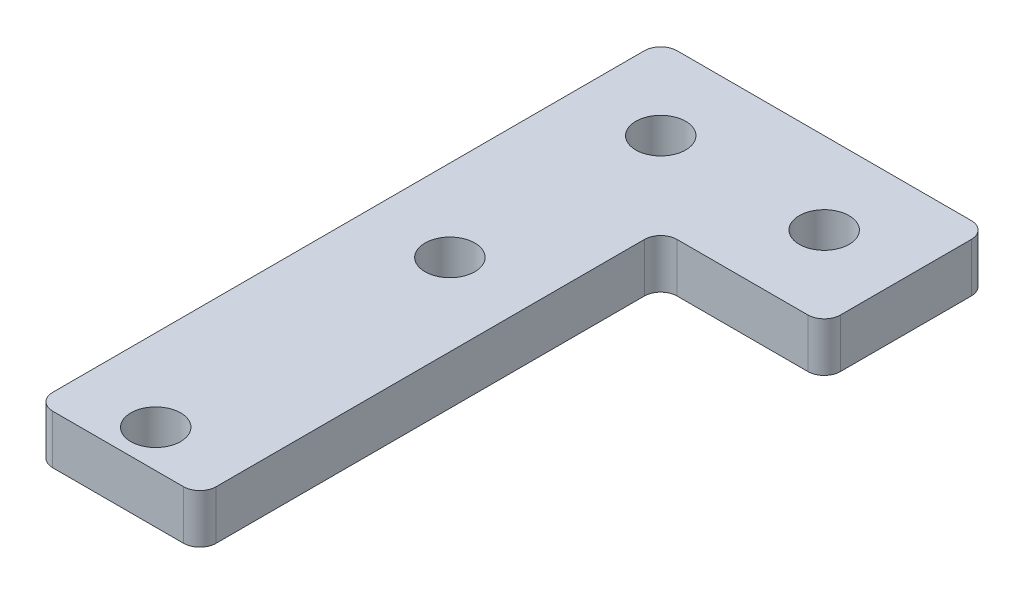
ISO-10303-21;
HEADER;
FILE_DESCRIPTION(('STEP AP214'),'2;1');
FILE_NAME('part.step','',(''),(''),'','','');
FILE_SCHEMA(('AUTOMOTIVE_DESIGN { 1 0 10303 214 1 1 1 1 }'));
ENDSEC;
DATA;
#1=APPLICATION_CONTEXT('core data for automotive mechanical design processes');
#2=APPLICATION_PROTOCOL_DEFINITION('international standard','automotive_design',2000,#1);
#3=PRODUCT_CONTEXT('',#1,'mechanical');
#4=PRODUCT('Part','Part','',(#3));
#5=PRODUCT_RELATED_PRODUCT_CATEGORY('part','',(#4));
#6=PRODUCT_DEFINITION_FORMATION('','',#4);
#7=PRODUCT_DEFINITION_CONTEXT('part definition',#1,'design');
#8=PRODUCT_DEFINITION('design','',#6,#7);
#9=PRODUCT_DEFINITION_SHAPE('','',#8);
#10=(LENGTH_UNIT() NAMED_UNIT(*) SI_UNIT(.MILLI.,.METRE.));
#11=(NAMED_UNIT(*) PLANE_ANGLE_UNIT() SI_UNIT($,.RADIAN.));
#12=(NAMED_UNIT(*) SI_UNIT($,.STERADIAN.) SOLID_ANGLE_UNIT());
#13=UNCERTAINTY_MEASURE_WITH_UNIT(LENGTH_MEASURE(1.E-05),#10,'distance_accuracy_value','');
#14=(GEOMETRIC_REPRESENTATION_CONTEXT(3) GLOBAL_UNCERTAINTY_ASSIGNED_CONTEXT((#13)) GLOBAL_UNIT_ASSIGNED_CONTEXT((#10,
#11,#12)) REPRESENTATION_CONTEXT('',''));
#15=CARTESIAN_POINT('',(0.,0.,0.));
#16=DIRECTION('',(0.,0.,1.));
#17=DIRECTION('',(1.,0.,0.));
#18=AXIS2_PLACEMENT_3D('',#15,#16,#17);
#19=CARTESIAN_POINT('',(10.,3.,0.));
#20=DIRECTION('',(1.,0.,0.));
#21=DIRECTION('',(0.,0.,-1.));
#22=AXIS2_PLACEMENT_3D('',#19,#20,#21);
#23=PLANE('',#22);
#24=DIRECTION('',(0.,0.,1.));
#25=VECTOR('',#24,1.);
#26=CARTESIAN_POINT('',(10.,0.,0.));
#27=LINE('',#26,#25);
#28=CARTESIAN_POINT('',(10.,0.,-4.6));
#29=VERTEX_POINT('',#28);
#30=CARTESIAN_POINT('',(10.,0.,21.6));
#31=VERTEX_POINT('',#30);
#32=EDGE_CURVE('E200',#29,#31,#27,.T.);
#33=ORIENTED_EDGE('',*,*,#32,.F.);
#34=DIRECTION('',(0.,-1.,0.));
#35=VECTOR('',#34,1.);
#36=CARTESIAN_POINT('',(10.,3.,-4.6));
#37=LINE('',#36,#35);
#38=CARTESIAN_POINT('',(10.,3.,-4.6));
#39=VERTEX_POINT('',#38);
#40=EDGE_CURVE('E193',#29,#39,#37,.F.);
#41=ORIENTED_EDGE('',*,*,#40,.T.);
#42=DIRECTION('',(0.,0.,1.));
#43=VECTOR('',#42,1.);
#44=CARTESIAN_POINT('',(10.,3.,0.));
#45=LINE('',#44,#43);
#46=CARTESIAN_POINT('',(10.,3.,21.6));
#47=VERTEX_POINT('',#46);
#48=EDGE_CURVE('E220',#39,#47,#45,.T.);
#49=ORIENTED_EDGE('',*,*,#48,.T.);
#50=DIRECTION('',(0.,-1.,0.));
#51=VECTOR('',#50,1.);
#52=CARTESIAN_POINT('',(10.,0.,21.6));
#53=LINE('',#52,#51);
#54=EDGE_CURVE('E190',#47,#31,#53,.T.);
#55=ORIENTED_EDGE('',*,*,#54,.T.);
#56=EDGE_LOOP('',(#33,#41,#49,#55));
#57=FACE_BOUND('',#56,.T.);
#58=ADVANCED_FACE('F41',(#57),#23,.T.);
#59=CARTESIAN_POINT('',(0.,3.,-5.6));
#60=DIRECTION('',(0.,0.,-1.));
#61=DIRECTION('',(-1.,0.,0.));
#62=AXIS2_PLACEMENT_3D('',#59,#60,#61);
#63=PLANE('',#62);
#64=DIRECTION('',(1.,0.,0.));
#65=VECTOR('',#64,1.);
#66=CARTESIAN_POINT('',(0.,3.,-5.6));
#67=LINE('',#66,#65);
#68=CARTESIAN_POINT('',(11.,3.,-5.6));
#69=VERTEX_POINT('',#68);
#70=CARTESIAN_POINT('',(19.,3.,-5.6));
#71=VERTEX_POINT('',#70);
#72=EDGE_CURVE('E218',#69,#71,#67,.T.);
#73=ORIENTED_EDGE('',*,*,#72,.F.);
#74=DIRECTION('',(0.,-1.,0.));
#75=VECTOR('',#74,1.);
#76=CARTESIAN_POINT('',(11.,3.,-5.6));
#77=LINE('',#76,#75);
#78=CARTESIAN_POINT('',(11.,0.,-5.6));
#79=VERTEX_POINT('',#78);
#80=EDGE_CURVE('E187',#69,#79,#77,.T.);
#81=ORIENTED_EDGE('',*,*,#80,.T.);
#82=DIRECTION('',(1.,0.,0.));
#83=VECTOR('',#82,1.);
#84=CARTESIAN_POINT('',(0.,0.,-5.6));
#85=LINE('',#84,#83);
#86=CARTESIAN_POINT('',(19.,0.,-5.6));
#87=VERTEX_POINT('',#86);
#88=EDGE_CURVE('E202',#79,#87,#85,.T.);
#89=ORIENTED_EDGE('',*,*,#88,.T.);
#90=DIRECTION('',(0.,-1.,0.));
#91=VECTOR('',#90,1.);
#92=CARTESIAN_POINT('',(19.,3.,-5.6));
#93=LINE('',#92,#91);
#94=EDGE_CURVE('E185',#87,#71,#93,.F.);
#95=ORIENTED_EDGE('',*,*,#94,.T.);
#96=EDGE_LOOP('',(#73,#81,#89,#95));
#97=FACE_BOUND('',#96,.T.);
#98=ADVANCED_FACE('F222',(#97),#63,.F.);
#99=CARTESIAN_POINT('',(20.,3.,0.));
#100=DIRECTION('',(-1.,0.,0.));
#101=DIRECTION('',(0.,0.,1.));
#102=AXIS2_PLACEMENT_3D('',#99,#100,#101);
#103=PLANE('',#102);
#104=DIRECTION('',(0.,0.,-1.));
#105=VECTOR('',#104,1.);
#106=CARTESIAN_POINT('',(20.,0.,0.));
#107=LINE('',#106,#105);
#108=CARTESIAN_POINT('',(20.,0.,-6.6));
#109=VERTEX_POINT('',#108);
#110=CARTESIAN_POINT('',(20.,0.,-14.6));
#111=VERTEX_POINT('',#110);
#112=EDGE_CURVE('E248',#109,#111,#107,.T.);
#113=ORIENTED_EDGE('',*,*,#112,.T.);
#114=DIRECTION('',(0.,-1.,0.));
#115=VECTOR('',#114,1.);
#116=CARTESIAN_POINT('',(20.,3.,-14.6));
#117=LINE('',#116,#115);
#118=CARTESIAN_POINT('',(20.,3.,-14.6));
#119=VERTEX_POINT('',#118);
#120=EDGE_CURVE('E183',#111,#119,#117,.F.);
#121=ORIENTED_EDGE('',*,*,#120,.T.);
#122=DIRECTION('',(0.,0.,-1.));
#123=VECTOR('',#122,1.);
#124=CARTESIAN_POINT('',(20.,3.,0.));
#125=LINE('',#124,#123);
#126=CARTESIAN_POINT('',(20.,3.,-6.6));
#127=VERTEX_POINT('',#126);
#128=EDGE_CURVE('E224',#127,#119,#125,.T.);
#129=ORIENTED_EDGE('',*,*,#128,.F.);
#130=DIRECTION('',(0.,-1.,0.));
#131=VECTOR('',#130,1.);
#132=CARTESIAN_POINT('',(20.,3.,-6.6));
#133=LINE('',#132,#131);
#134=EDGE_CURVE('E180',#127,#109,#133,.T.);
#135=ORIENTED_EDGE('',*,*,#134,.T.);
#136=EDGE_LOOP('',(#113,#121,#129,#135));
#137=FACE_BOUND('',#136,.T.);
#138=ADVANCED_FACE('F267',(#137),#103,.F.);
#139=CARTESIAN_POINT('',(0.,3.,-15.6));
#140=DIRECTION('',(0.,0.,-1.));
#141=DIRECTION('',(-1.,0.,0.));
#142=AXIS2_PLACEMENT_3D('',#139,#140,#141);
#143=PLANE('',#142);
#144=DIRECTION('',(1.,0.,0.));
#145=VECTOR('',#144,1.);
#146=CARTESIAN_POINT('',(0.,0.,-15.6));
#147=LINE('',#146,#145);
#148=CARTESIAN_POINT('',(1.,0.,-15.6));
#149=VERTEX_POINT('',#148);
#150=CARTESIAN_POINT('',(19.,0.,-15.6));
#151=VERTEX_POINT('',#150);
#152=EDGE_CURVE('E150',#149,#151,#147,.T.);
#153=ORIENTED_EDGE('',*,*,#152,.F.);
#154=DIRECTION('',(0.,-1.,0.));
#155=VECTOR('',#154,1.);
#156=CARTESIAN_POINT('',(1.,3.,-15.6));
#157=LINE('',#156,#155);
#158=CARTESIAN_POINT('',(1.,3.,-15.6));
#159=VERTEX_POINT('',#158);
#160=EDGE_CURVE('E169',#149,#159,#157,.F.);
#161=ORIENTED_EDGE('',*,*,#160,.T.);
#162=DIRECTION('',(1.,0.,0.));
#163=VECTOR('',#162,1.);
#164=CARTESIAN_POINT('',(0.,3.,-15.6));
#165=LINE('',#164,#163);
#166=CARTESIAN_POINT('',(19.,3.,-15.6));
#167=VERTEX_POINT('',#166);
#168=EDGE_CURVE('E227',#159,#167,#165,.T.);
#169=ORIENTED_EDGE('',*,*,#168,.T.);
#170=DIRECTION('',(0.,-1.,0.));
#171=VECTOR('',#170,1.);
#172=CARTESIAN_POINT('',(19.,0.,-15.6));
#173=LINE('',#172,#171);
#174=EDGE_CURVE('E166',#167,#151,#173,.T.);
#175=ORIENTED_EDGE('',*,*,#174,.T.);
#176=EDGE_LOOP('',(#153,#161,#169,#175));
#177=FACE_BOUND('',#176,.T.);
#178=ADVANCED_FACE('F256',(#177),#143,.T.);
#179=CARTESIAN_POINT('',(0.,3.,0.));
#180=DIRECTION('',(-1.,0.,0.));
#181=DIRECTION('',(0.,0.,1.));
#182=AXIS2_PLACEMENT_3D('',#179,#180,#181);
#183=PLANE('',#182);
#184=DIRECTION('',(0.,0.,-1.));
#185=VECTOR('',#184,1.);
#186=CARTESIAN_POINT('',(0.,3.,0.));
#187=LINE('',#186,#185);
#188=CARTESIAN_POINT('',(0.,3.,21.6));
#189=VERTEX_POINT('',#188);
#190=CARTESIAN_POINT('',(0.,3.,-14.6));
#191=VERTEX_POINT('',#190);
#192=EDGE_CURVE('E156',#189,#191,#187,.T.);
#193=ORIENTED_EDGE('',*,*,#192,.T.);
#194=DIRECTION('',(0.,-1.,0.));
#195=VECTOR('',#194,1.);
#196=CARTESIAN_POINT('',(0.,3.,-14.6));
#197=LINE('',#196,#195);
#198=CARTESIAN_POINT('',(0.,0.,-14.6));
#199=VERTEX_POINT('',#198);
#200=EDGE_CURVE('E149',#191,#199,#197,.T.);
#201=ORIENTED_EDGE('',*,*,#200,.T.);
#202=DIRECTION('',(0.,0.,-1.));
#203=VECTOR('',#202,1.);
#204=CARTESIAN_POINT('',(0.,0.,0.));
#205=LINE('',#204,#203);
#206=CARTESIAN_POINT('',(0.,0.,21.6));
#207=VERTEX_POINT('',#206);
#208=EDGE_CURVE('E134',#207,#199,#205,.T.);
#209=ORIENTED_EDGE('',*,*,#208,.F.);
#210=DIRECTION('',(0.,-1.,0.));
#211=VECTOR('',#210,1.);
#212=CARTESIAN_POINT('',(0.,3.,21.6));
#213=LINE('',#212,#211);
#214=EDGE_CURVE('E147',#207,#189,#213,.F.);
#215=ORIENTED_EDGE('',*,*,#214,.T.);
#216=EDGE_LOOP('',(#193,#201,#209,#215));
#217=FACE_BOUND('',#216,.T.);
#218=ADVANCED_FACE('F146',(#217),#183,.T.);
#219=CARTESIAN_POINT('',(5.,3.,-10.6));
#220=DIRECTION('',(0.,-1.,0.));
#221=DIRECTION('',(0.,0.,-1.));
#222=AXIS2_PLACEMENT_3D('',#219,#220,#221);
#223=CYLINDRICAL_SURFACE('',#222,1.525);
#224=CARTESIAN_POINT('',(5.,3.,-10.6));
#225=DIRECTION('',(0.,1.,0.));
#226=DIRECTION('',(0.,0.,1.));
#227=AXIS2_PLACEMENT_3D('',#224,#225,#226);
#228=CIRCLE('',#227,1.525);
#229=CARTESIAN_POINT('',(5.,3.,-9.075));
#230=VERTEX_POINT('',#229);
#231=EDGE_CURVE('E229',#230,#230,#228,.T.);
#232=ORIENTED_EDGE('',*,*,#231,.T.);
#233=EDGE_LOOP('',(#232));
#234=FACE_BOUND('',#233,.T.);
#235=CARTESIAN_POINT('',(5.,0.,-10.6));
#236=DIRECTION('',(0.,1.,0.));
#237=DIRECTION('',(0.,0.,1.));
#238=AXIS2_PLACEMENT_3D('',#235,#236,#237);
#239=CIRCLE('',#238,1.525);
#240=CARTESIAN_POINT('',(5.,0.,-9.075));
#241=VERTEX_POINT('',#240);
#242=EDGE_CURVE('E210',#241,#241,#239,.T.);
#243=ORIENTED_EDGE('',*,*,#242,.F.);
#244=EDGE_LOOP('',(#243));
#245=FACE_BOUND('',#244,.T.);
#246=ADVANCED_FACE('F287',(#234,#245),#223,.F.);
#247=CARTESIAN_POINT('',(15.,3.,-10.6));
#248=DIRECTION('',(0.,-1.,0.));
#249=DIRECTION('',(0.,0.,-1.));
#250=AXIS2_PLACEMENT_3D('',#247,#248,#249);
#251=CYLINDRICAL_SURFACE('',#250,1.525);
#252=CARTESIAN_POINT('',(15.,3.,-10.6));
#253=DIRECTION('',(0.,1.,0.));
#254=DIRECTION('',(0.,0.,1.));
#255=AXIS2_PLACEMENT_3D('',#252,#253,#254);
#256=CIRCLE('',#255,1.525);
#257=CARTESIAN_POINT('',(15.,3.,-9.075));
#258=VERTEX_POINT('',#257);
#259=EDGE_CURVE('E345',#258,#258,#256,.T.);
#260=ORIENTED_EDGE('',*,*,#259,.T.);
#261=EDGE_LOOP('',(#260));
#262=FACE_BOUND('',#261,.T.);
#263=CARTESIAN_POINT('',(15.,0.,-10.6));
#264=DIRECTION('',(0.,1.,0.));
#265=DIRECTION('',(0.,0.,1.));
#266=AXIS2_PLACEMENT_3D('',#263,#264,#265);
#267=CIRCLE('',#266,1.525);
#268=CARTESIAN_POINT('',(15.,0.,-9.075));
#269=VERTEX_POINT('',#268);
#270=EDGE_CURVE('E242',#269,#269,#267,.T.);
#271=ORIENTED_EDGE('',*,*,#270,.F.);
#272=EDGE_LOOP('',(#271));
#273=FACE_BOUND('',#272,.T.);
#274=ADVANCED_FACE('F290',(#262,#273),#251,.F.);
#275=CARTESIAN_POINT('',(5.,3.,2.3));
#276=DIRECTION('',(0.,-1.,0.));
#277=DIRECTION('',(0.,0.,-1.));
#278=AXIS2_PLACEMENT_3D('',#275,#276,#277);
#279=CYLINDRICAL_SURFACE('',#278,1.525);
#280=CARTESIAN_POINT('',(5.,3.,2.3));
#281=DIRECTION('',(0.,1.,0.));
#282=DIRECTION('',(0.,0.,1.));
#283=AXIS2_PLACEMENT_3D('',#280,#281,#282);
#284=CIRCLE('',#283,1.525);
#285=CARTESIAN_POINT('',(5.,3.,3.82500000000001));
#286=VERTEX_POINT('',#285);
#287=EDGE_CURVE('E341',#286,#286,#284,.T.);
#288=ORIENTED_EDGE('',*,*,#287,.T.);
#289=EDGE_LOOP('',(#288));
#290=FACE_BOUND('',#289,.T.);
#291=CARTESIAN_POINT('',(5.,0.,2.3));
#292=DIRECTION('',(0.,1.,0.));
#293=DIRECTION('',(0.,0.,1.));
#294=AXIS2_PLACEMENT_3D('',#291,#292,#293);
#295=CIRCLE('',#294,1.525);
#296=CARTESIAN_POINT('',(5.,0.,3.82500000000001));
#297=VERTEX_POINT('',#296);
#298=EDGE_CURVE('E239',#297,#297,#295,.T.);
#299=ORIENTED_EDGE('',*,*,#298,.F.);
#300=EDGE_LOOP('',(#299));
#301=FACE_BOUND('',#300,.T.);
#302=ADVANCED_FACE('F294',(#290,#301),#279,.F.);
#303=CARTESIAN_POINT('',(5.,3.,20.3));
#304=DIRECTION('',(0.,-1.,0.));
#305=DIRECTION('',(0.,0.,-1.));
#306=AXIS2_PLACEMENT_3D('',#303,#304,#305);
#307=CYLINDRICAL_SURFACE('',#306,1.525);
#308=CARTESIAN_POINT('',(5.,3.,20.3));
#309=DIRECTION('',(0.,1.,0.));
#310=DIRECTION('',(0.,0.,1.));
#311=AXIS2_PLACEMENT_3D('',#308,#309,#310);
#312=CIRCLE('',#311,1.525);
#313=CARTESIAN_POINT('',(5.,3.,21.825));
#314=VERTEX_POINT('',#313);
#315=EDGE_CURVE('E339',#314,#314,#312,.T.);
#316=ORIENTED_EDGE('',*,*,#315,.T.);
#317=EDGE_LOOP('',(#316));
#318=FACE_BOUND('',#317,.T.);
#319=CARTESIAN_POINT('',(5.,0.,20.3));
#320=DIRECTION('',(0.,1.,0.));
#321=DIRECTION('',(0.,0.,1.));
#322=AXIS2_PLACEMENT_3D('',#319,#320,#321);
#323=CIRCLE('',#322,1.525);
#324=CARTESIAN_POINT('',(5.,0.,21.825));
#325=VERTEX_POINT('',#324);
#326=EDGE_CURVE('E236',#325,#325,#323,.T.);
#327=ORIENTED_EDGE('',*,*,#326,.F.);
#328=EDGE_LOOP('',(#327));
#329=FACE_BOUND('',#328,.T.);
#330=ADVANCED_FACE('F298',(#318,#329),#307,.F.);
#331=CARTESIAN_POINT('',(0.,3.,22.6));
#332=DIRECTION('',(0.,0.,-1.));
#333=DIRECTION('',(-1.,0.,0.));
#334=AXIS2_PLACEMENT_3D('',#331,#332,#333);
#335=PLANE('',#334);
#336=DIRECTION('',(1.,0.,0.));
#337=VECTOR('',#336,1.);
#338=CARTESIAN_POINT('',(0.,3.,22.6));
#339=LINE('',#338,#337);
#340=CARTESIAN_POINT('',(1.,3.,22.6));
#341=VERTEX_POINT('',#340);
#342=CARTESIAN_POINT('',(9.00000000000001,3.,22.6));
#343=VERTEX_POINT('',#342);
#344=EDGE_CURVE('E153',#341,#343,#339,.T.);
#345=ORIENTED_EDGE('',*,*,#344,.F.);
#346=DIRECTION('',(0.,-1.,0.));
#347=VECTOR('',#346,1.);
#348=CARTESIAN_POINT('',(1.,0.,22.6));
#349=LINE('',#348,#347);
#350=CARTESIAN_POINT('',(1.,0.,22.6));
#351=VERTEX_POINT('',#350);
#352=EDGE_CURVE('E196',#341,#351,#349,.T.);
#353=ORIENTED_EDGE('',*,*,#352,.T.);
#354=DIRECTION('',(1.,0.,0.));
#355=VECTOR('',#354,1.);
#356=CARTESIAN_POINT('',(0.,0.,22.6));
#357=LINE('',#356,#355);
#358=CARTESIAN_POINT('',(9.00000000000001,0.,22.6));
#359=VERTEX_POINT('',#358);
#360=EDGE_CURVE('E135',#351,#359,#357,.T.);
#361=ORIENTED_EDGE('',*,*,#360,.T.);
#362=DIRECTION('',(0.,-1.,0.));
#363=VECTOR('',#362,1.);
#364=CARTESIAN_POINT('',(9.00000000000001,3.,22.6));
#365=LINE('',#364,#363);
#366=EDGE_CURVE('E56',#359,#343,#365,.F.);
#367=ORIENTED_EDGE('',*,*,#366,.T.);
#368=EDGE_LOOP('',(#345,#353,#361,#367));
#369=FACE_BOUND('',#368,.T.);
#370=ADVANCED_FACE('F301',(#369),#335,.F.);
#371=CARTESIAN_POINT('',(0.,3.,0.));
#372=DIRECTION('',(0.,1.,0.));
#373=DIRECTION('',(0.,0.,1.));
#374=AXIS2_PLACEMENT_3D('',#371,#372,#373);
#375=PLANE('',#374);
#376=ORIENTED_EDGE('',*,*,#315,.F.);
#377=EDGE_LOOP('',(#376));
#378=FACE_BOUND('',#377,.T.);
#379=ORIENTED_EDGE('',*,*,#287,.F.);
#380=EDGE_LOOP('',(#379));
#381=FACE_BOUND('',#380,.T.);
#382=ORIENTED_EDGE('',*,*,#259,.F.);
#383=EDGE_LOOP('',(#382));
#384=FACE_BOUND('',#383,.T.);
#385=ORIENTED_EDGE('',*,*,#231,.F.);
#386=EDGE_LOOP('',(#385));
#387=FACE_BOUND('',#386,.T.);
#388=ORIENTED_EDGE('',*,*,#168,.F.);
#389=CARTESIAN_POINT('',(1.,3.,-14.6));
#390=DIRECTION('',(0.,1.,0.));
#391=DIRECTION('',(0.,0.,1.));
#392=AXIS2_PLACEMENT_3D('',#389,#390,#391);
#393=CIRCLE('',#392,1.);
#394=EDGE_CURVE('E178',#159,#191,#393,.T.);
#395=ORIENTED_EDGE('',*,*,#394,.T.);
#396=ORIENTED_EDGE('',*,*,#192,.F.);
#397=CARTESIAN_POINT('',(1.,3.,21.6));
#398=DIRECTION('',(0.,1.,0.));
#399=DIRECTION('',(0.,0.,1.));
#400=AXIS2_PLACEMENT_3D('',#397,#398,#399);
#401=CIRCLE('',#400,1.);
#402=EDGE_CURVE('E63',#189,#341,#401,.T.);
#403=ORIENTED_EDGE('',*,*,#402,.T.);
#404=ORIENTED_EDGE('',*,*,#344,.T.);
#405=CARTESIAN_POINT('',(9.00000000000001,3.,21.6));
#406=DIRECTION('',(0.,1.,0.));
#407=DIRECTION('',(0.,0.,1.));
#408=AXIS2_PLACEMENT_3D('',#405,#406,#407);
#409=CIRCLE('',#408,1.);
#410=EDGE_CURVE('E171',#343,#47,#409,.T.);
#411=ORIENTED_EDGE('',*,*,#410,.T.);
#412=ORIENTED_EDGE('',*,*,#48,.F.);
#413=CARTESIAN_POINT('',(11.,3.,-4.6));
#414=DIRECTION('',(0.,1.,0.));
#415=DIRECTION('',(0.,0.,1.));
#416=AXIS2_PLACEMENT_3D('',#413,#414,#415);
#417=CIRCLE('',#416,1.);
#418=EDGE_CURVE('E11',#39,#69,#417,.F.);
#419=ORIENTED_EDGE('',*,*,#418,.T.);
#420=ORIENTED_EDGE('',*,*,#72,.T.);
#421=CARTESIAN_POINT('',(19.,3.,-6.6));
#422=DIRECTION('',(0.,1.,0.));
#423=DIRECTION('',(0.,0.,1.));
#424=AXIS2_PLACEMENT_3D('',#421,#422,#423);
#425=CIRCLE('',#424,1.);
#426=EDGE_CURVE('E174',#71,#127,#425,.T.);
#427=ORIENTED_EDGE('',*,*,#426,.T.);
#428=ORIENTED_EDGE('',*,*,#128,.T.);
#429=CARTESIAN_POINT('',(19.,3.,-14.6));
#430=DIRECTION('',(0.,1.,0.));
#431=DIRECTION('',(0.,0.,1.));
#432=AXIS2_PLACEMENT_3D('',#429,#430,#431);
#433=CIRCLE('',#432,1.);
#434=EDGE_CURVE('E176',#119,#167,#433,.T.);
#435=ORIENTED_EDGE('',*,*,#434,.T.);
#436=EDGE_LOOP('',(#388,#395,#396,#403,#404,#411,#412,#419,#420,#427,#428,#435));
#437=FACE_BOUND('',#436,.T.);
#438=ADVANCED_FACE('F217',(#378,#381,#384,#387,#437),#375,.T.);
#439=CARTESIAN_POINT('',(0.,0.,0.));
#440=DIRECTION('',(0.,1.,0.));
#441=DIRECTION('',(0.,0.,1.));
#442=AXIS2_PLACEMENT_3D('',#439,#440,#441);
#443=PLANE('',#442);
#444=ORIENTED_EDGE('',*,*,#326,.T.);
#445=EDGE_LOOP('',(#444));
#446=FACE_BOUND('',#445,.T.);
#447=ORIENTED_EDGE('',*,*,#298,.T.);
#448=EDGE_LOOP('',(#447));
#449=FACE_BOUND('',#448,.T.);
#450=ORIENTED_EDGE('',*,*,#270,.T.);
#451=EDGE_LOOP('',(#450));
#452=FACE_BOUND('',#451,.T.);
#453=ORIENTED_EDGE('',*,*,#242,.T.);
#454=EDGE_LOOP('',(#453));
#455=FACE_BOUND('',#454,.T.);
#456=ORIENTED_EDGE('',*,*,#208,.T.);
#457=CARTESIAN_POINT('',(1.,0.,-14.6));
#458=DIRECTION('',(0.,1.,0.));
#459=DIRECTION('',(0.,0.,1.));
#460=AXIS2_PLACEMENT_3D('',#457,#458,#459);
#461=CIRCLE('',#460,1.);
#462=EDGE_CURVE('E164',#199,#149,#461,.F.);
#463=ORIENTED_EDGE('',*,*,#462,.T.);
#464=ORIENTED_EDGE('',*,*,#152,.T.);
#465=CARTESIAN_POINT('',(19.,0.,-14.6));
#466=DIRECTION('',(0.,1.,0.));
#467=DIRECTION('',(0.,0.,1.));
#468=AXIS2_PLACEMENT_3D('',#465,#466,#467);
#469=CIRCLE('',#468,1.);
#470=EDGE_CURVE('E162',#151,#111,#469,.F.);
#471=ORIENTED_EDGE('',*,*,#470,.T.);
#472=ORIENTED_EDGE('',*,*,#112,.F.);
#473=CARTESIAN_POINT('',(19.,0.,-6.6));
#474=DIRECTION('',(0.,1.,0.));
#475=DIRECTION('',(0.,0.,1.));
#476=AXIS2_PLACEMENT_3D('',#473,#474,#475);
#477=CIRCLE('',#476,1.);
#478=EDGE_CURVE('E140',#109,#87,#477,.F.);
#479=ORIENTED_EDGE('',*,*,#478,.T.);
#480=ORIENTED_EDGE('',*,*,#88,.F.);
#481=CARTESIAN_POINT('',(11.,0.,-4.6));
#482=DIRECTION('',(0.,1.,0.));
#483=DIRECTION('',(0.,0.,1.));
#484=AXIS2_PLACEMENT_3D('',#481,#482,#483);
#485=CIRCLE('',#484,1.);
#486=EDGE_CURVE('E49',#79,#29,#485,.T.);
#487=ORIENTED_EDGE('',*,*,#486,.T.);
#488=ORIENTED_EDGE('',*,*,#32,.T.);
#489=CARTESIAN_POINT('',(9.00000000000001,0.,21.6));
#490=DIRECTION('',(0.,1.,0.));
#491=DIRECTION('',(0.,0.,1.));
#492=AXIS2_PLACEMENT_3D('',#489,#490,#491);
#493=CIRCLE('',#492,1.);
#494=EDGE_CURVE('E141',#31,#359,#493,.F.);
#495=ORIENTED_EDGE('',*,*,#494,.T.);
#496=ORIENTED_EDGE('',*,*,#360,.F.);
#497=CARTESIAN_POINT('',(1.,0.,21.6));
#498=DIRECTION('',(0.,1.,0.));
#499=DIRECTION('',(0.,0.,1.));
#500=AXIS2_PLACEMENT_3D('',#497,#498,#499);
#501=CIRCLE('',#500,1.);
#502=EDGE_CURVE('E131',#351,#207,#501,.F.);
#503=ORIENTED_EDGE('',*,*,#502,.T.);
#504=EDGE_LOOP('',(#456,#463,#464,#471,#472,#479,#480,#487,#488,#495,#496,#503));
#505=FACE_BOUND('',#504,.T.);
#506=ADVANCED_FACE('F133',(#446,#449,#452,#455,#505),#443,.F.);
#507=CARTESIAN_POINT('',(1.,3.,-14.6));
#508=DIRECTION('',(0.,-1.,0.));
#509=DIRECTION('',(0.,0.,-1.));
#510=AXIS2_PLACEMENT_3D('',#507,#508,#509);
#511=CYLINDRICAL_SURFACE('',#510,1.);
#512=ORIENTED_EDGE('',*,*,#394,.F.);
#513=ORIENTED_EDGE('',*,*,#160,.F.);
#514=ORIENTED_EDGE('',*,*,#462,.F.);
#515=ORIENTED_EDGE('',*,*,#200,.F.);
#516=EDGE_LOOP('',(#512,#513,#514,#515));
#517=FACE_BOUND('',#516,.T.);
#518=ADVANCED_FACE('F260',(#517),#511,.T.);
#519=CARTESIAN_POINT('',(19.,3.,-14.6));
#520=DIRECTION('',(0.,1.,0.));
#521=DIRECTION('',(0.,0.,1.));
#522=AXIS2_PLACEMENT_3D('',#519,#520,#521);
#523=CYLINDRICAL_SURFACE('',#522,1.);
#524=ORIENTED_EDGE('',*,*,#434,.F.);
#525=ORIENTED_EDGE('',*,*,#120,.F.);
#526=ORIENTED_EDGE('',*,*,#470,.F.);
#527=ORIENTED_EDGE('',*,*,#174,.F.);
#528=EDGE_LOOP('',(#524,#525,#526,#527));
#529=FACE_BOUND('',#528,.T.);
#530=ADVANCED_FACE('F263',(#529),#523,.T.);
#531=CARTESIAN_POINT('',(11.,3.,-4.6));
#532=DIRECTION('',(0.,-1.,0.));
#533=DIRECTION('',(0.,0.,-1.));
#534=AXIS2_PLACEMENT_3D('',#531,#532,#533);
#535=CYLINDRICAL_SURFACE('',#534,1.);
#536=ORIENTED_EDGE('',*,*,#418,.F.);
#537=ORIENTED_EDGE('',*,*,#40,.F.);
#538=ORIENTED_EDGE('',*,*,#486,.F.);
#539=ORIENTED_EDGE('',*,*,#80,.F.);
#540=EDGE_LOOP('',(#536,#537,#538,#539));
#541=FACE_BOUND('',#540,.T.);
#542=ADVANCED_FACE('F213',(#541),#535,.F.);
#543=CARTESIAN_POINT('',(19.,3.,-6.6));
#544=DIRECTION('',(0.,-1.,0.));
#545=DIRECTION('',(0.,0.,-1.));
#546=AXIS2_PLACEMENT_3D('',#543,#544,#545);
#547=CYLINDRICAL_SURFACE('',#546,1.);
#548=ORIENTED_EDGE('',*,*,#426,.F.);
#549=ORIENTED_EDGE('',*,*,#94,.F.);
#550=ORIENTED_EDGE('',*,*,#478,.F.);
#551=ORIENTED_EDGE('',*,*,#134,.F.);
#552=EDGE_LOOP('',(#548,#549,#550,#551));
#553=FACE_BOUND('',#552,.T.);
#554=ADVANCED_FACE('F270',(#553),#547,.T.);
#555=CARTESIAN_POINT('',(1.,3.,21.6));
#556=DIRECTION('',(0.,1.,0.));
#557=DIRECTION('',(0.,0.,1.));
#558=AXIS2_PLACEMENT_3D('',#555,#556,#557);
#559=CYLINDRICAL_SURFACE('',#558,1.);
#560=ORIENTED_EDGE('',*,*,#402,.F.);
#561=ORIENTED_EDGE('',*,*,#214,.F.);
#562=ORIENTED_EDGE('',*,*,#502,.F.);
#563=ORIENTED_EDGE('',*,*,#352,.F.);
#564=EDGE_LOOP('',(#560,#561,#562,#563));
#565=FACE_BOUND('',#564,.T.);
#566=ADVANCED_FACE('F152',(#565),#559,.T.);
#567=CARTESIAN_POINT('',(9.00000000000001,3.,21.6));
#568=DIRECTION('',(0.,1.,0.));
#569=DIRECTION('',(0.,0.,1.));
#570=AXIS2_PLACEMENT_3D('',#567,#568,#569);
#571=CYLINDRICAL_SURFACE('',#570,1.);
#572=ORIENTED_EDGE('',*,*,#410,.F.);
#573=ORIENTED_EDGE('',*,*,#366,.F.);
#574=ORIENTED_EDGE('',*,*,#494,.F.);
#575=ORIENTED_EDGE('',*,*,#54,.F.);
#576=EDGE_LOOP('',(#572,#573,#574,#575));
#577=FACE_BOUND('',#576,.T.);
#578=ADVANCED_FACE('F43',(#577),#571,.T.);
#579=CLOSED_SHELL('',(#58,#98,#138,#178,#218,#246,#274,#302,#330,#370,#438,#506,#518,#530,#542,
#554,#566,#578));
#580=MANIFOLD_SOLID_BREP('B2',#579);
#581=ADVANCED_BREP_SHAPE_REPRESENTATION('',(#18,#580),#14);
#582=SHAPE_DEFINITION_REPRESENTATION(#9,#581);
ENDSEC;
END-ISO-10303-21;
